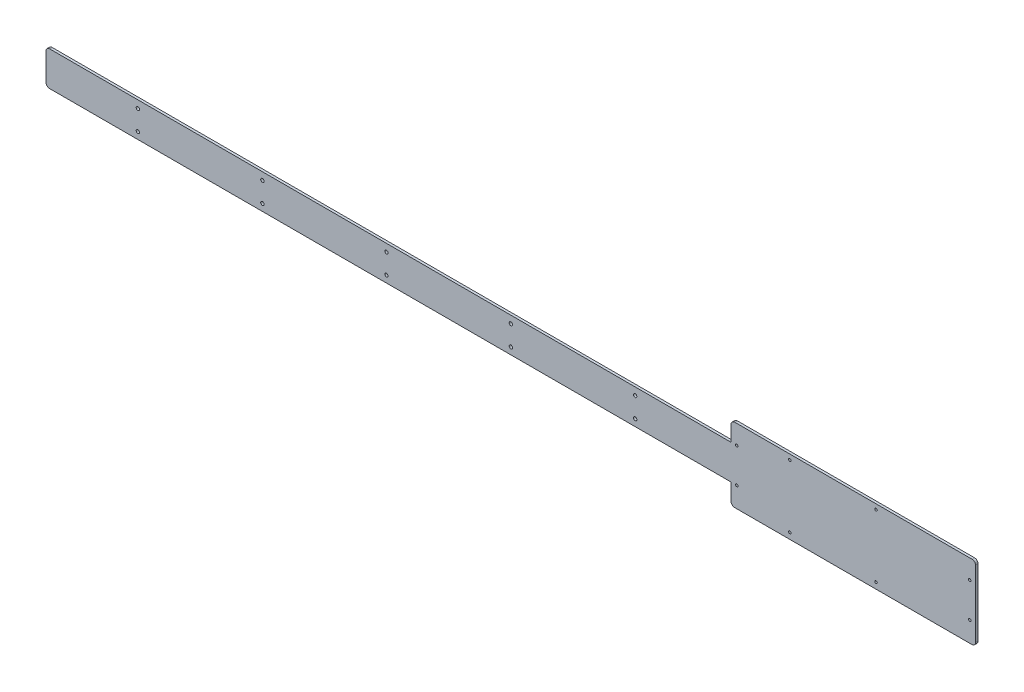
ISO-10303-21;
HEADER;
FILE_DESCRIPTION(('STEP AP214'),'2;1');
FILE_NAME('part.step','',(''),(''),'','','');
FILE_SCHEMA(('AUTOMOTIVE_DESIGN { 1 0 10303 214 1 1 1 1 }'));
ENDSEC;
DATA;
#1=APPLICATION_CONTEXT('core data for automotive mechanical design processes');
#2=APPLICATION_PROTOCOL_DEFINITION('international standard','automotive_design',2000,#1);
#3=PRODUCT_CONTEXT('',#1,'mechanical');
#4=PRODUCT('Part','Part','',(#3));
#5=PRODUCT_RELATED_PRODUCT_CATEGORY('part','',(#4));
#6=PRODUCT_DEFINITION_FORMATION('','',#4);
#7=PRODUCT_DEFINITION_CONTEXT('part definition',#1,'design');
#8=PRODUCT_DEFINITION('design','',#6,#7);
#9=PRODUCT_DEFINITION_SHAPE('','',#8);
#10=(LENGTH_UNIT() NAMED_UNIT(*) SI_UNIT(.MILLI.,.METRE.));
#11=(NAMED_UNIT(*) PLANE_ANGLE_UNIT() SI_UNIT($,.RADIAN.));
#12=(NAMED_UNIT(*) SI_UNIT($,.STERADIAN.) SOLID_ANGLE_UNIT());
#13=UNCERTAINTY_MEASURE_WITH_UNIT(LENGTH_MEASURE(1.E-05),#10,'distance_accuracy_value','');
#14=(GEOMETRIC_REPRESENTATION_CONTEXT(3) GLOBAL_UNCERTAINTY_ASSIGNED_CONTEXT((#13)) GLOBAL_UNIT_ASSIGNED_CONTEXT((#10,
#11,#12)) REPRESENTATION_CONTEXT('',''));
#15=CARTESIAN_POINT('',(0.,0.,0.));
#16=DIRECTION('',(0.,0.,1.));
#17=DIRECTION('',(1.,0.,0.));
#18=AXIS2_PLACEMENT_3D('',#15,#16,#17);
#19=CARTESIAN_POINT('',(699.960441306371,0.,2.54));
#20=DIRECTION('',(-1.,0.,0.));
#21=DIRECTION('',(0.,0.,1.));
#22=AXIS2_PLACEMENT_3D('',#19,#20,#21);
#23=PLANE('',#22);
#24=DIRECTION('',(0.,1.,0.));
#25=VECTOR('',#24,1.);
#26=CARTESIAN_POINT('',(699.960441306371,0.,0.));
#27=LINE('',#26,#25);
#28=CARTESIAN_POINT('',(699.960441306371,64.0125980584344,0.));
#29=VERTEX_POINT('',#28);
#30=CARTESIAN_POINT('',(699.960441306371,81.011908200962,0.));
#31=VERTEX_POINT('',#30);
#32=EDGE_CURVE('E384',#29,#31,#27,.T.);
#33=ORIENTED_EDGE('',*,*,#32,.F.);
#34=DIRECTION('',(0.,0.,-1.));
#35=VECTOR('',#34,1.);
#36=CARTESIAN_POINT('',(699.960441306371,64.0125980584344,2.54));
#37=LINE('',#36,#35);
#38=CARTESIAN_POINT('',(699.960441306371,64.0125980584344,2.54));
#39=VERTEX_POINT('',#38);
#40=EDGE_CURVE('E12',#39,#29,#37,.T.);
#41=ORIENTED_EDGE('',*,*,#40,.F.);
#42=DIRECTION('',(0.,1.,0.));
#43=VECTOR('',#42,1.);
#44=CARTESIAN_POINT('',(699.960441306371,0.,2.54));
#45=LINE('',#44,#43);
#46=CARTESIAN_POINT('',(699.960441306371,81.011908200962,2.54));
#47=VERTEX_POINT('',#46);
#48=EDGE_CURVE('E227',#39,#47,#45,.T.);
#49=ORIENTED_EDGE('',*,*,#48,.T.);
#50=DIRECTION('',(0.,0.,-1.));
#51=VECTOR('',#50,1.);
#52=CARTESIAN_POINT('',(699.960441306371,81.011908200962,2.54));
#53=LINE('',#52,#51);
#54=EDGE_CURVE('E113',#47,#31,#53,.T.);
#55=ORIENTED_EDGE('',*,*,#54,.T.);
#56=EDGE_LOOP('',(#33,#41,#49,#55));
#57=FACE_BOUND('',#56,.T.);
#58=ADVANCED_FACE('F42',(#57),#23,.T.);
#59=CARTESIAN_POINT('',(703.874541781116,64.1628071050607,2.54));
#60=DIRECTION('',(0.,0.,-1.));
#61=DIRECTION('',(-1.,0.,0.));
#62=AXIS2_PLACEMENT_3D('',#59,#60,#61);
#63=CYLINDRICAL_SURFACE('',#62,3.91698165480587);
#64=CARTESIAN_POINT('',(703.874541781116,64.1628071050607,0.));
#65=DIRECTION('',(0.,0.,1.));
#66=DIRECTION('',(1.,0.,0.));
#67=AXIS2_PLACEMENT_3D('',#64,#65,#66);
#68=CIRCLE('',#67,3.91698165480587);
#69=CARTESIAN_POINT('',(704.024750827742,60.2487066303159,0.));
#70=VERTEX_POINT('',#69);
#71=EDGE_CURVE('E381',#29,#70,#68,.T.);
#72=ORIENTED_EDGE('',*,*,#71,.T.);
#73=DIRECTION('',(0.,0.,-1.));
#74=VECTOR('',#73,1.);
#75=CARTESIAN_POINT('',(704.024750827742,60.2487066303159,2.54));
#76=LINE('',#75,#74);
#77=CARTESIAN_POINT('',(704.024750827742,60.2487066303159,2.54));
#78=VERTEX_POINT('',#77);
#79=EDGE_CURVE('E52',#78,#70,#76,.T.);
#80=ORIENTED_EDGE('',*,*,#79,.F.);
#81=CARTESIAN_POINT('',(703.874541781116,64.1628071050607,2.54));
#82=DIRECTION('',(0.,0.,1.));
#83=DIRECTION('',(1.,0.,0.));
#84=AXIS2_PLACEMENT_3D('',#81,#82,#83);
#85=CIRCLE('',#84,3.91698165480587);
#86=EDGE_CURVE('E222',#39,#78,#85,.T.);
#87=ORIENTED_EDGE('',*,*,#86,.F.);
#88=ORIENTED_EDGE('',*,*,#40,.T.);
#89=EDGE_LOOP('',(#72,#80,#87,#88));
#90=FACE_BOUND('',#89,.T.);
#91=ADVANCED_FACE('F382',(#90),#63,.T.);
#92=CARTESIAN_POINT('',(0.,60.2487066303159,2.54));
#93=DIRECTION('',(0.,1.,0.));
#94=DIRECTION('',(0.,0.,1.));
#95=AXIS2_PLACEMENT_3D('',#92,#93,#94);
#96=PLANE('',#95);
#97=DIRECTION('',(1.,0.,0.));
#98=VECTOR('',#97,1.);
#99=CARTESIAN_POINT('',(0.,60.2487066303159,0.));
#100=LINE('',#99,#98);
#101=CARTESIAN_POINT('',(946.192785632129,60.2487066303159,0.));
#102=VERTEX_POINT('',#101);
#103=EDGE_CURVE('E377',#70,#102,#100,.T.);
#104=ORIENTED_EDGE('',*,*,#103,.T.);
#105=DIRECTION('',(0.,0.,-1.));
#106=VECTOR('',#105,1.);
#107=CARTESIAN_POINT('',(946.192785632129,60.2487066303159,2.54));
#108=LINE('',#107,#106);
#109=CARTESIAN_POINT('',(946.192785632129,60.2487066303159,2.54));
#110=VERTEX_POINT('',#109);
#111=EDGE_CURVE('E367',#110,#102,#108,.T.);
#112=ORIENTED_EDGE('',*,*,#111,.F.);
#113=DIRECTION('',(1.,0.,0.));
#114=VECTOR('',#113,1.);
#115=CARTESIAN_POINT('',(0.,60.2487066303159,2.54));
#116=LINE('',#115,#114);
#117=EDGE_CURVE('E218',#78,#110,#116,.T.);
#118=ORIENTED_EDGE('',*,*,#117,.F.);
#119=ORIENTED_EDGE('',*,*,#79,.T.);
#120=EDGE_LOOP('',(#104,#112,#118,#119));
#121=FACE_BOUND('',#120,.T.);
#122=ADVANCED_FACE('F375',(#121),#96,.F.);
#123=CARTESIAN_POINT('',(946.083931557599,63.9037439839047,2.54));
#124=DIRECTION('',(0.,0.,-1.));
#125=DIRECTION('',(-1.,0.,0.));
#126=AXIS2_PLACEMENT_3D('',#123,#124,#125);
#127=CYLINDRICAL_SURFACE('',#126,3.65665793665086);
#128=CARTESIAN_POINT('',(946.083931557599,63.9037439839047,0.));
#129=DIRECTION('',(0.,0.,1.));
#130=DIRECTION('',(1.,0.,0.));
#131=AXIS2_PLACEMENT_3D('',#128,#129,#130);
#132=CIRCLE('',#131,3.65665793665086);
#133=CARTESIAN_POINT('',(949.738968911188,64.0125980584344,0.));
#134=VERTEX_POINT('',#133);
#135=EDGE_CURVE('E388',#134,#102,#132,.F.);
#136=ORIENTED_EDGE('',*,*,#135,.F.);
#137=DIRECTION('',(0.,0.,-1.));
#138=VECTOR('',#137,1.);
#139=CARTESIAN_POINT('',(949.738968911188,64.0125980584344,2.54));
#140=LINE('',#139,#138);
#141=CARTESIAN_POINT('',(949.738968911188,64.0125980584344,2.54));
#142=VERTEX_POINT('',#141);
#143=EDGE_CURVE('E364',#142,#134,#140,.T.);
#144=ORIENTED_EDGE('',*,*,#143,.F.);
#145=CARTESIAN_POINT('',(946.083931557599,63.9037439839047,2.54));
#146=DIRECTION('',(0.,0.,1.));
#147=DIRECTION('',(1.,0.,0.));
#148=AXIS2_PLACEMENT_3D('',#145,#146,#147);
#149=CIRCLE('',#148,3.65665793665086);
#150=EDGE_CURVE('E215',#142,#110,#149,.F.);
#151=ORIENTED_EDGE('',*,*,#150,.T.);
#152=ORIENTED_EDGE('',*,*,#111,.T.);
#153=EDGE_LOOP('',(#136,#144,#151,#152));
#154=FACE_BOUND('',#153,.T.);
#155=ADVANCED_FACE('F455',(#154),#127,.T.);
#156=CARTESIAN_POINT('',(949.738968911188,1.54013838980953E-12,2.54));
#157=DIRECTION('',(1.,0.,0.));
#158=DIRECTION('',(0.,1.,0.));
#159=AXIS2_PLACEMENT_3D('',#156,#157,#158);
#160=PLANE('',#159);
#161=DIRECTION('',(0.,-1.,0.));
#162=VECTOR('',#161,1.);
#163=CARTESIAN_POINT('',(949.738968911188,1.54013838980953E-12,0.));
#164=LINE('',#163,#162);
#165=CARTESIAN_POINT('',(949.738968911188,132.475411377396,0.));
#166=VERTEX_POINT('',#165);
#167=EDGE_CURVE('E396',#166,#134,#164,.T.);
#168=ORIENTED_EDGE('',*,*,#167,.F.);
#169=DIRECTION('',(0.,0.,-1.));
#170=VECTOR('',#169,1.);
#171=CARTESIAN_POINT('',(949.738968911188,132.475411377396,2.54));
#172=LINE('',#171,#170);
#173=CARTESIAN_POINT('',(949.738968911188,132.475411377396,2.54));
#174=VERTEX_POINT('',#173);
#175=EDGE_CURVE('E361',#174,#166,#172,.T.);
#176=ORIENTED_EDGE('',*,*,#175,.F.);
#177=DIRECTION('',(0.,-1.,0.));
#178=VECTOR('',#177,1.);
#179=CARTESIAN_POINT('',(949.738968911188,1.54013838980953E-12,2.54));
#180=LINE('',#179,#178);
#181=EDGE_CURVE('E210',#174,#142,#180,.T.);
#182=ORIENTED_EDGE('',*,*,#181,.T.);
#183=ORIENTED_EDGE('',*,*,#143,.T.);
#184=EDGE_LOOP('',(#168,#176,#182,#183));
#185=FACE_BOUND('',#184,.T.);
#186=ADVANCED_FACE('F451',(#185),#160,.T.);
#187=CARTESIAN_POINT('',(946.29718513407,132.371011875455,2.54));
#188=DIRECTION('',(0.,0.,-1.));
#189=DIRECTION('',(-1.,0.,0.));
#190=AXIS2_PLACEMENT_3D('',#187,#188,#189);
#191=CYLINDRICAL_SURFACE('',#190,3.44336678621955);
#192=CARTESIAN_POINT('',(946.29718513407,132.371011875455,0.));
#193=DIRECTION('',(0.,0.,1.));
#194=DIRECTION('',(1.,0.,0.));
#195=AXIS2_PLACEMENT_3D('',#192,#193,#194);
#196=CIRCLE('',#195,3.44336678621955);
#197=CARTESIAN_POINT('',(946.192785632129,135.812795652574,0.));
#198=VERTEX_POINT('',#197);
#199=EDGE_CURVE('E400',#198,#166,#196,.F.);
#200=ORIENTED_EDGE('',*,*,#199,.F.);
#201=DIRECTION('',(0.,0.,-1.));
#202=VECTOR('',#201,1.);
#203=CARTESIAN_POINT('',(946.192785632129,135.812795652574,2.54));
#204=LINE('',#203,#202);
#205=CARTESIAN_POINT('',(946.192785632129,135.812795652574,2.54));
#206=VERTEX_POINT('',#205);
#207=EDGE_CURVE('E358',#206,#198,#204,.T.);
#208=ORIENTED_EDGE('',*,*,#207,.F.);
#209=CARTESIAN_POINT('',(946.29718513407,132.371011875455,2.54));
#210=DIRECTION('',(0.,0.,1.));
#211=DIRECTION('',(1.,0.,0.));
#212=AXIS2_PLACEMENT_3D('',#209,#210,#211);
#213=CIRCLE('',#212,3.44336678621955);
#214=EDGE_CURVE('E204',#206,#174,#213,.F.);
#215=ORIENTED_EDGE('',*,*,#214,.T.);
#216=ORIENTED_EDGE('',*,*,#175,.T.);
#217=EDGE_LOOP('',(#200,#208,#215,#216));
#218=FACE_BOUND('',#217,.T.);
#219=ADVANCED_FACE('F447',(#218),#191,.T.);
#220=CARTESIAN_POINT('',(0.,135.812795652574,2.54));
#221=DIRECTION('',(0.,1.,0.));
#222=DIRECTION('',(0.,0.,1.));
#223=AXIS2_PLACEMENT_3D('',#220,#221,#222);
#224=PLANE('',#223);
#225=DIRECTION('',(1.,0.,0.));
#226=VECTOR('',#225,1.);
#227=CARTESIAN_POINT('',(0.,135.812795652574,0.));
#228=LINE('',#227,#226);
#229=CARTESIAN_POINT('',(704.024750827742,135.812795652574,0.));
#230=VERTEX_POINT('',#229);
#231=EDGE_CURVE('E404',#230,#198,#228,.T.);
#232=ORIENTED_EDGE('',*,*,#231,.F.);
#233=DIRECTION('',(0.,0.,-1.));
#234=VECTOR('',#233,1.);
#235=CARTESIAN_POINT('',(704.024750827742,135.812795652574,2.54));
#236=LINE('',#235,#234);
#237=CARTESIAN_POINT('',(704.024750827742,135.812795652574,2.54));
#238=VERTEX_POINT('',#237);
#239=EDGE_CURVE('E355',#238,#230,#236,.T.);
#240=ORIENTED_EDGE('',*,*,#239,.F.);
#241=DIRECTION('',(1.,0.,0.));
#242=VECTOR('',#241,1.);
#243=CARTESIAN_POINT('',(0.,135.812795652574,2.54));
#244=LINE('',#243,#242);
#245=EDGE_CURVE('E199',#238,#206,#244,.T.);
#246=ORIENTED_EDGE('',*,*,#245,.T.);
#247=ORIENTED_EDGE('',*,*,#207,.T.);
#248=EDGE_LOOP('',(#232,#240,#246,#247));
#249=FACE_BOUND('',#248,.T.);
#250=ADVANCED_FACE('F442',(#249),#224,.T.);
#251=CARTESIAN_POINT('',(703.946912219851,131.826324739094,2.54));
#252=DIRECTION('',(0.,0.,-1.));
#253=DIRECTION('',(-1.,0.,0.));
#254=AXIS2_PLACEMENT_3D('',#251,#252,#253);
#255=CYLINDRICAL_SURFACE('',#254,3.98723076744948);
#256=CARTESIAN_POINT('',(703.946912219851,131.826324739094,0.));
#257=DIRECTION('',(0.,0.,1.));
#258=DIRECTION('',(1.,0.,0.));
#259=AXIS2_PLACEMENT_3D('',#256,#257,#258);
#260=CIRCLE('',#259,3.98723076744948);
#261=CARTESIAN_POINT('',(699.960441306371,131.904163346986,0.));
#262=VERTEX_POINT('',#261);
#263=EDGE_CURVE('E408',#262,#230,#260,.F.);
#264=ORIENTED_EDGE('',*,*,#263,.F.);
#265=DIRECTION('',(0.,0.,-1.));
#266=VECTOR('',#265,1.);
#267=CARTESIAN_POINT('',(699.960441306371,131.904163346986,2.54));
#268=LINE('',#267,#266);
#269=CARTESIAN_POINT('',(699.960441306371,131.904163346986,2.54));
#270=VERTEX_POINT('',#269);
#271=EDGE_CURVE('E352',#270,#262,#268,.T.);
#272=ORIENTED_EDGE('',*,*,#271,.F.);
#273=CARTESIAN_POINT('',(703.946912219851,131.826324739094,2.54));
#274=DIRECTION('',(0.,0.,1.));
#275=DIRECTION('',(1.,0.,0.));
#276=AXIS2_PLACEMENT_3D('',#273,#274,#275);
#277=CIRCLE('',#276,3.98723076744948);
#278=EDGE_CURVE('E195',#270,#238,#277,.F.);
#279=ORIENTED_EDGE('',*,*,#278,.T.);
#280=ORIENTED_EDGE('',*,*,#239,.T.);
#281=EDGE_LOOP('',(#264,#272,#279,#280));
#282=FACE_BOUND('',#281,.T.);
#283=ADVANCED_FACE('F438',(#282),#255,.T.);
#284=CARTESIAN_POINT('',(699.960441306371,0.,2.54));
#285=DIRECTION('',(-1.,0.,0.));
#286=DIRECTION('',(0.,0.,1.));
#287=AXIS2_PLACEMENT_3D('',#284,#285,#286);
#288=PLANE('',#287);
#289=DIRECTION('',(0.,1.,0.));
#290=VECTOR('',#289,1.);
#291=CARTESIAN_POINT('',(699.960441306371,0.,0.));
#292=LINE('',#291,#290);
#293=CARTESIAN_POINT('',(699.960441306371,116.182433669927,0.));
#294=VERTEX_POINT('',#293);
#295=EDGE_CURVE('E412',#294,#262,#292,.T.);
#296=ORIENTED_EDGE('',*,*,#295,.F.);
#297=DIRECTION('',(0.,0.,-1.));
#298=VECTOR('',#297,1.);
#299=CARTESIAN_POINT('',(699.960441306371,116.182433669927,2.54));
#300=LINE('',#299,#298);
#301=CARTESIAN_POINT('',(699.960441306371,116.182433669927,2.54));
#302=VERTEX_POINT('',#301);
#303=EDGE_CURVE('E349',#302,#294,#300,.T.);
#304=ORIENTED_EDGE('',*,*,#303,.F.);
#305=DIRECTION('',(0.,1.,0.));
#306=VECTOR('',#305,1.);
#307=CARTESIAN_POINT('',(699.960441306371,0.,2.54));
#308=LINE('',#307,#306);
#309=EDGE_CURVE('E190',#302,#270,#308,.T.);
#310=ORIENTED_EDGE('',*,*,#309,.T.);
#311=ORIENTED_EDGE('',*,*,#271,.T.);
#312=EDGE_LOOP('',(#296,#304,#310,#311));
#313=FACE_BOUND('',#312,.T.);
#314=ADVANCED_FACE('F434',(#313),#288,.T.);
#315=CARTESIAN_POINT('',(0.,116.182433669927,2.54));
#316=DIRECTION('',(0.,1.,0.));
#317=DIRECTION('',(0.,0.,1.));
#318=AXIS2_PLACEMENT_3D('',#315,#316,#317);
#319=PLANE('',#318);
#320=DIRECTION('',(1.,0.,0.));
#321=VECTOR('',#320,1.);
#322=CARTESIAN_POINT('',(0.,116.182433669927,0.));
#323=LINE('',#322,#321);
#324=CARTESIAN_POINT('',(4.28543596522853,116.182433669927,0.));
#325=VERTEX_POINT('',#324);
#326=EDGE_CURVE('E416',#325,#294,#323,.T.);
#327=ORIENTED_EDGE('',*,*,#326,.F.);
#328=DIRECTION('',(0.,0.,-1.));
#329=VECTOR('',#328,1.);
#330=CARTESIAN_POINT('',(4.28543596522853,116.182433669927,2.54));
#331=LINE('',#330,#329);
#332=CARTESIAN_POINT('',(4.28543596522853,116.182433669927,2.54));
#333=VERTEX_POINT('',#332);
#334=EDGE_CURVE('E346',#333,#325,#331,.T.);
#335=ORIENTED_EDGE('',*,*,#334,.F.);
#336=DIRECTION('',(1.,0.,0.));
#337=VECTOR('',#336,1.);
#338=CARTESIAN_POINT('',(0.,116.182433669927,2.54));
#339=LINE('',#338,#337);
#340=EDGE_CURVE('E177',#333,#302,#339,.T.);
#341=ORIENTED_EDGE('',*,*,#340,.T.);
#342=ORIENTED_EDGE('',*,*,#303,.T.);
#343=EDGE_LOOP('',(#327,#335,#341,#342));
#344=FACE_BOUND('',#343,.T.);
#345=ADVANCED_FACE('F430',(#344),#319,.T.);
#346=CARTESIAN_POINT('',(4.13979787096996,112.402258463638,2.54));
#347=DIRECTION('',(0.,0.,-1.));
#348=DIRECTION('',(-1.,0.,0.));
#349=AXIS2_PLACEMENT_3D('',#346,#347,#348);
#350=CYLINDRICAL_SURFACE('',#349,3.78297965164233);
#351=CARTESIAN_POINT('',(4.13979787096996,112.402258463638,0.));
#352=DIRECTION('',(0.,0.,1.));
#353=DIRECTION('',(1.,0.,0.));
#354=AXIS2_PLACEMENT_3D('',#351,#352,#353);
#355=CIRCLE('',#354,3.78297965164233);
#356=CARTESIAN_POINT('',(0.359622664681157,112.547896557897,0.));
#357=VERTEX_POINT('',#356);
#358=EDGE_CURVE('E420',#357,#325,#355,.F.);
#359=ORIENTED_EDGE('',*,*,#358,.F.);
#360=DIRECTION('',(0.,0.,-1.));
#361=VECTOR('',#360,1.);
#362=CARTESIAN_POINT('',(0.359622664681157,112.547896557897,2.54));
#363=LINE('',#362,#361);
#364=CARTESIAN_POINT('',(0.359622664681157,112.547896557897,2.54));
#365=VERTEX_POINT('',#364);
#366=EDGE_CURVE('E161',#365,#357,#363,.T.);
#367=ORIENTED_EDGE('',*,*,#366,.F.);
#368=CARTESIAN_POINT('',(4.13979787096996,112.402258463638,2.54));
#369=DIRECTION('',(0.,0.,1.));
#370=DIRECTION('',(1.,0.,0.));
#371=AXIS2_PLACEMENT_3D('',#368,#369,#370);
#372=CIRCLE('',#371,3.78297965164233);
#373=EDGE_CURVE('E173',#365,#333,#372,.F.);
#374=ORIENTED_EDGE('',*,*,#373,.T.);
#375=ORIENTED_EDGE('',*,*,#334,.T.);
#376=EDGE_LOOP('',(#359,#367,#374,#375));
#377=FACE_BOUND('',#376,.T.);
#378=ADVANCED_FACE('F428',(#377),#350,.T.);
#379=CARTESIAN_POINT('',(0.359622664681157,0.,2.54));
#380=DIRECTION('',(-1.,0.,0.));
#381=DIRECTION('',(0.,0.,1.));
#382=AXIS2_PLACEMENT_3D('',#379,#380,#381);
#383=PLANE('',#382);
#384=DIRECTION('',(0.,1.,0.));
#385=VECTOR('',#384,1.);
#386=CARTESIAN_POINT('',(0.359622664681157,0.,0.));
#387=LINE('',#386,#385);
#388=CARTESIAN_POINT('',(0.359622664681157,84.6476269962459,0.));
#389=VERTEX_POINT('',#388);
#390=EDGE_CURVE('E157',#389,#357,#387,.T.);
#391=ORIENTED_EDGE('',*,*,#390,.F.);
#392=DIRECTION('',(0.,0.,-1.));
#393=VECTOR('',#392,1.);
#394=CARTESIAN_POINT('',(0.359622664681157,84.6476269962459,2.54));
#395=LINE('',#394,#393);
#396=CARTESIAN_POINT('',(0.359622664681157,84.6476269962459,2.54));
#397=VERTEX_POINT('',#396);
#398=EDGE_CURVE('E151',#397,#389,#395,.T.);
#399=ORIENTED_EDGE('',*,*,#398,.F.);
#400=DIRECTION('',(0.,1.,0.));
#401=VECTOR('',#400,1.);
#402=CARTESIAN_POINT('',(0.359622664681157,0.,2.54));
#403=LINE('',#402,#401);
#404=EDGE_CURVE('E155',#397,#365,#403,.T.);
#405=ORIENTED_EDGE('',*,*,#404,.T.);
#406=ORIENTED_EDGE('',*,*,#366,.T.);
#407=EDGE_LOOP('',(#391,#399,#405,#406));
#408=FACE_BOUND('',#407,.T.);
#409=ADVANCED_FACE('F153',(#408),#383,.T.);
#410=CARTESIAN_POINT('',(4.14038871259682,84.7926742488777,2.54));
#411=DIRECTION('',(0.,0.,-1.));
#412=DIRECTION('',(-1.,0.,0.));
#413=AXIS2_PLACEMENT_3D('',#410,#411,#412);
#414=CYLINDRICAL_SURFACE('',#413,3.7835473585734);
#415=CARTESIAN_POINT('',(4.14038871259682,84.7926742488777,0.));
#416=DIRECTION('',(0.,0.,1.));
#417=DIRECTION('',(1.,0.,0.));
#418=AXIS2_PLACEMENT_3D('',#415,#416,#417);
#419=CIRCLE('',#418,3.7835473585734);
#420=CARTESIAN_POINT('',(4.28543596522853,81.011908200962,0.));
#421=VERTEX_POINT('',#420);
#422=EDGE_CURVE('E333',#389,#421,#419,.T.);
#423=ORIENTED_EDGE('',*,*,#422,.T.);
#424=DIRECTION('',(0.,0.,-1.));
#425=VECTOR('',#424,1.);
#426=CARTESIAN_POINT('',(4.28543596522853,81.011908200962,2.54));
#427=LINE('',#426,#425);
#428=CARTESIAN_POINT('',(4.28543596522853,81.011908200962,2.54));
#429=VERTEX_POINT('',#428);
#430=EDGE_CURVE('E162',#429,#421,#427,.T.);
#431=ORIENTED_EDGE('',*,*,#430,.F.);
#432=CARTESIAN_POINT('',(4.14038871259682,84.7926742488777,2.54));
#433=DIRECTION('',(0.,0.,1.));
#434=DIRECTION('',(1.,0.,0.));
#435=AXIS2_PLACEMENT_3D('',#432,#433,#434);
#436=CIRCLE('',#435,3.7835473585734);
#437=EDGE_CURVE('E165',#397,#429,#436,.T.);
#438=ORIENTED_EDGE('',*,*,#437,.F.);
#439=ORIENTED_EDGE('',*,*,#398,.T.);
#440=EDGE_LOOP('',(#423,#431,#438,#439));
#441=FACE_BOUND('',#440,.T.);
#442=ADVANCED_FACE('F166',(#441),#414,.T.);
#443=CARTESIAN_POINT('',(94.1622142002001,88.0911071642846,2.54));
#444=DIRECTION('',(0.,0.,-1.));
#445=DIRECTION('',(-1.,0.,0.));
#446=AXIS2_PLACEMENT_3D('',#443,#444,#445);
#447=CYLINDRICAL_SURFACE('',#446,1.72009541650323);
#448=CARTESIAN_POINT('',(94.1622142002001,88.0911071642846,2.54));
#449=DIRECTION('',(0.,0.,1.));
#450=DIRECTION('',(1.,0.,0.));
#451=AXIS2_PLACEMENT_3D('',#448,#449,#450);
#452=CIRCLE('',#451,1.72009541650323);
#453=CARTESIAN_POINT('',(95.8823096167033,88.0911071642846,2.54));
#454=VERTEX_POINT('',#453);
#455=EDGE_CURVE('E235',#454,#454,#452,.T.);
#456=ORIENTED_EDGE('',*,*,#455,.T.);
#457=EDGE_LOOP('',(#456));
#458=FACE_BOUND('',#457,.T.);
#459=CARTESIAN_POINT('',(94.1622142002001,88.0911071642846,0.));
#460=DIRECTION('',(0.,0.,1.));
#461=DIRECTION('',(1.,0.,0.));
#462=AXIS2_PLACEMENT_3D('',#459,#460,#461);
#463=CIRCLE('',#462,1.72009541650323);
#464=CARTESIAN_POINT('',(95.8823096167033,88.0911071642846,0.));
#465=VERTEX_POINT('',#464);
#466=EDGE_CURVE('E390',#465,#465,#463,.T.);
#467=ORIENTED_EDGE('',*,*,#466,.F.);
#468=EDGE_LOOP('',(#467));
#469=FACE_BOUND('',#468,.T.);
#470=ADVANCED_FACE('F505',(#458,#469),#447,.F.);
#471=CARTESIAN_POINT('',(94.1622142002001,108.484732818826,2.54));
#472=DIRECTION('',(0.,0.,-1.));
#473=DIRECTION('',(-1.,0.,0.));
#474=AXIS2_PLACEMENT_3D('',#471,#472,#473);
#475=CYLINDRICAL_SURFACE('',#474,1.72009541650324);
#476=CARTESIAN_POINT('',(94.1622142002001,108.484732818826,2.54));
#477=DIRECTION('',(0.,0.,1.));
#478=DIRECTION('',(1.,0.,0.));
#479=AXIS2_PLACEMENT_3D('',#476,#477,#478);
#480=CIRCLE('',#479,1.72009541650324);
#481=CARTESIAN_POINT('',(95.8823096167033,108.484732818826,2.54));
#482=VERTEX_POINT('',#481);
#483=EDGE_CURVE('E239',#482,#482,#480,.T.);
#484=ORIENTED_EDGE('',*,*,#483,.T.);
#485=EDGE_LOOP('',(#484));
#486=FACE_BOUND('',#485,.T.);
#487=CARTESIAN_POINT('',(94.1622142002001,108.484732818826,0.));
#488=DIRECTION('',(0.,0.,1.));
#489=DIRECTION('',(1.,0.,0.));
#490=AXIS2_PLACEMENT_3D('',#487,#488,#489);
#491=CIRCLE('',#490,1.72009541650324);
#492=CARTESIAN_POINT('',(95.8823096167033,108.484732818826,0.));
#493=VERTEX_POINT('',#492);
#494=EDGE_CURVE('E514',#493,#493,#491,.T.);
#495=ORIENTED_EDGE('',*,*,#494,.F.);
#496=EDGE_LOOP('',(#495));
#497=FACE_BOUND('',#496,.T.);
#498=ADVANCED_FACE('F508',(#486,#497),#475,.F.);
#499=CARTESIAN_POINT('',(221.392126763807,108.484732818826,2.54));
#500=DIRECTION('',(0.,0.,-1.));
#501=DIRECTION('',(-1.,0.,0.));
#502=AXIS2_PLACEMENT_3D('',#499,#500,#501);
#503=CYLINDRICAL_SURFACE('',#502,1.72009541650327);
#504=CARTESIAN_POINT('',(221.392126763807,108.484732818826,2.54));
#505=DIRECTION('',(0.,0.,1.));
#506=DIRECTION('',(1.,0.,0.));
#507=AXIS2_PLACEMENT_3D('',#504,#505,#506);
#508=CIRCLE('',#507,1.72009541650327);
#509=CARTESIAN_POINT('',(223.11222218031,108.484732818826,2.54));
#510=VERTEX_POINT('',#509);
#511=EDGE_CURVE('E244',#510,#510,#508,.T.);
#512=ORIENTED_EDGE('',*,*,#511,.T.);
#513=EDGE_LOOP('',(#512));
#514=FACE_BOUND('',#513,.T.);
#515=CARTESIAN_POINT('',(221.392126763807,108.484732818826,0.));
#516=DIRECTION('',(0.,0.,1.));
#517=DIRECTION('',(1.,0.,0.));
#518=AXIS2_PLACEMENT_3D('',#515,#516,#517);
#519=CIRCLE('',#518,1.72009541650327);
#520=CARTESIAN_POINT('',(223.11222218031,108.484732818826,0.));
#521=VERTEX_POINT('',#520);
#522=EDGE_CURVE('E517',#521,#521,#519,.T.);
#523=ORIENTED_EDGE('',*,*,#522,.F.);
#524=EDGE_LOOP('',(#523));
#525=FACE_BOUND('',#524,.T.);
#526=ADVANCED_FACE('F606',(#514,#525),#503,.F.);
#527=CARTESIAN_POINT('',(221.392126763807,88.0911071642846,2.54));
#528=DIRECTION('',(0.,0.,-1.));
#529=DIRECTION('',(-1.,0.,0.));
#530=AXIS2_PLACEMENT_3D('',#527,#528,#529);
#531=CYLINDRICAL_SURFACE('',#530,1.72009541650326);
#532=CARTESIAN_POINT('',(221.392126763807,88.0911071642846,2.54));
#533=DIRECTION('',(0.,0.,1.));
#534=DIRECTION('',(1.,0.,0.));
#535=AXIS2_PLACEMENT_3D('',#532,#533,#534);
#536=CIRCLE('',#535,1.72009541650326);
#537=CARTESIAN_POINT('',(223.11222218031,88.0911071642846,2.54));
#538=VERTEX_POINT('',#537);
#539=EDGE_CURVE('E249',#538,#538,#536,.T.);
#540=ORIENTED_EDGE('',*,*,#539,.T.);
#541=EDGE_LOOP('',(#540));
#542=FACE_BOUND('',#541,.T.);
#543=CARTESIAN_POINT('',(221.392126763807,88.0911071642846,0.));
#544=DIRECTION('',(0.,0.,1.));
#545=DIRECTION('',(1.,0.,0.));
#546=AXIS2_PLACEMENT_3D('',#543,#544,#545);
#547=CIRCLE('',#546,1.72009541650326);
#548=CARTESIAN_POINT('',(223.11222218031,88.0911071642846,0.));
#549=VERTEX_POINT('',#548);
#550=EDGE_CURVE('E523',#549,#549,#547,.T.);
#551=ORIENTED_EDGE('',*,*,#550,.F.);
#552=EDGE_LOOP('',(#551));
#553=FACE_BOUND('',#552,.T.);
#554=ADVANCED_FACE('F610',(#542,#553),#531,.F.);
#555=CARTESIAN_POINT('',(348.078760153048,108.484732818826,2.54));
#556=DIRECTION('',(0.,0.,-1.));
#557=DIRECTION('',(-1.,0.,0.));
#558=AXIS2_PLACEMENT_3D('',#555,#556,#557);
#559=CYLINDRICAL_SURFACE('',#558,1.72009541650319);
#560=CARTESIAN_POINT('',(348.078760153048,108.484732818826,2.54));
#561=DIRECTION('',(0.,0.,1.));
#562=DIRECTION('',(1.,0.,0.));
#563=AXIS2_PLACEMENT_3D('',#560,#561,#562);
#564=CIRCLE('',#563,1.72009541650319);
#565=CARTESIAN_POINT('',(349.798855569551,108.484732818826,2.54));
#566=VERTEX_POINT('',#565);
#567=EDGE_CURVE('E257',#566,#566,#564,.T.);
#568=ORIENTED_EDGE('',*,*,#567,.T.);
#569=EDGE_LOOP('',(#568));
#570=FACE_BOUND('',#569,.T.);
#571=CARTESIAN_POINT('',(348.078760153048,108.484732818826,0.));
#572=DIRECTION('',(0.,0.,1.));
#573=DIRECTION('',(1.,0.,0.));
#574=AXIS2_PLACEMENT_3D('',#571,#572,#573);
#575=CIRCLE('',#574,1.72009541650319);
#576=CARTESIAN_POINT('',(349.798855569551,108.484732818826,0.));
#577=VERTEX_POINT('',#576);
#578=EDGE_CURVE('E527',#577,#577,#575,.T.);
#579=ORIENTED_EDGE('',*,*,#578,.F.);
#580=EDGE_LOOP('',(#579));
#581=FACE_BOUND('',#580,.T.);
#582=ADVANCED_FACE('F614',(#570,#581),#559,.F.);
#583=CARTESIAN_POINT('',(348.078760153048,88.0911071642846,2.54));
#584=DIRECTION('',(0.,0.,-1.));
#585=DIRECTION('',(-1.,0.,0.));
#586=AXIS2_PLACEMENT_3D('',#583,#584,#585);
#587=CYLINDRICAL_SURFACE('',#586,1.63233578285859);
#588=CARTESIAN_POINT('',(348.078760153048,88.0911071642846,2.54));
#589=DIRECTION('',(0.,0.,1.));
#590=DIRECTION('',(1.,0.,0.));
#591=AXIS2_PLACEMENT_3D('',#588,#589,#590);
#592=CIRCLE('',#591,1.63233578285859);
#593=CARTESIAN_POINT('',(349.711095935907,88.0911071642846,2.54));
#594=VERTEX_POINT('',#593);
#595=EDGE_CURVE('E261',#594,#594,#592,.T.);
#596=ORIENTED_EDGE('',*,*,#595,.T.);
#597=EDGE_LOOP('',(#596));
#598=FACE_BOUND('',#597,.T.);
#599=CARTESIAN_POINT('',(348.078760153048,88.0911071642846,0.));
#600=DIRECTION('',(0.,0.,1.));
#601=DIRECTION('',(1.,0.,0.));
#602=AXIS2_PLACEMENT_3D('',#599,#600,#601);
#603=CIRCLE('',#602,1.63233578285859);
#604=CARTESIAN_POINT('',(349.711095935907,88.0911071642846,0.));
#605=VERTEX_POINT('',#604);
#606=EDGE_CURVE('E531',#605,#605,#603,.T.);
#607=ORIENTED_EDGE('',*,*,#606,.F.);
#608=EDGE_LOOP('',(#607));
#609=FACE_BOUND('',#608,.T.);
#610=ADVANCED_FACE('F618',(#598,#609),#587,.F.);
#611=CARTESIAN_POINT('',(475.146430574631,108.484732818826,2.54));
#612=DIRECTION('',(0.,0.,-1.));
#613=DIRECTION('',(-1.,0.,0.));
#614=AXIS2_PLACEMENT_3D('',#611,#612,#613);
#615=CYLINDRICAL_SURFACE('',#614,1.72009541650319);
#616=CARTESIAN_POINT('',(475.146430574631,108.484732818826,2.54));
#617=DIRECTION('',(0.,0.,1.));
#618=DIRECTION('',(1.,0.,0.));
#619=AXIS2_PLACEMENT_3D('',#616,#617,#618);
#620=CIRCLE('',#619,1.72009541650319);
#621=CARTESIAN_POINT('',(476.866525991134,108.484732818826,2.54));
#622=VERTEX_POINT('',#621);
#623=EDGE_CURVE('E266',#622,#622,#620,.T.);
#624=ORIENTED_EDGE('',*,*,#623,.T.);
#625=EDGE_LOOP('',(#624));
#626=FACE_BOUND('',#625,.T.);
#627=CARTESIAN_POINT('',(475.146430574631,108.484732818826,0.));
#628=DIRECTION('',(0.,0.,1.));
#629=DIRECTION('',(1.,0.,0.));
#630=AXIS2_PLACEMENT_3D('',#627,#628,#629);
#631=CIRCLE('',#630,1.72009541650319);
#632=CARTESIAN_POINT('',(476.866525991134,108.484732818826,0.));
#633=VERTEX_POINT('',#632);
#634=EDGE_CURVE('E535',#633,#633,#631,.T.);
#635=ORIENTED_EDGE('',*,*,#634,.F.);
#636=EDGE_LOOP('',(#635));
#637=FACE_BOUND('',#636,.T.);
#638=ADVANCED_FACE('F622',(#626,#637),#615,.F.);
#639=CARTESIAN_POINT('',(475.146430574631,88.0911071642846,2.54));
#640=DIRECTION('',(0.,0.,-1.));
#641=DIRECTION('',(-1.,0.,0.));
#642=AXIS2_PLACEMENT_3D('',#639,#640,#641);
#643=CYLINDRICAL_SURFACE('',#642,1.72009541650318);
#644=CARTESIAN_POINT('',(475.146430574631,88.0911071642846,2.54));
#645=DIRECTION('',(0.,0.,1.));
#646=DIRECTION('',(1.,0.,0.));
#647=AXIS2_PLACEMENT_3D('',#644,#645,#646);
#648=CIRCLE('',#647,1.72009541650318);
#649=CARTESIAN_POINT('',(476.866525991134,88.0911071642846,2.54));
#650=VERTEX_POINT('',#649);
#651=EDGE_CURVE('E271',#650,#650,#648,.T.);
#652=ORIENTED_EDGE('',*,*,#651,.T.);
#653=EDGE_LOOP('',(#652));
#654=FACE_BOUND('',#653,.T.);
#655=CARTESIAN_POINT('',(475.146430574631,88.0911071642846,0.));
#656=DIRECTION('',(0.,0.,1.));
#657=DIRECTION('',(1.,0.,0.));
#658=AXIS2_PLACEMENT_3D('',#655,#656,#657);
#659=CIRCLE('',#658,1.72009541650318);
#660=CARTESIAN_POINT('',(476.866525991134,88.0911071642846,0.));
#661=VERTEX_POINT('',#660);
#662=EDGE_CURVE('E539',#661,#661,#659,.T.);
#663=ORIENTED_EDGE('',*,*,#662,.F.);
#664=EDGE_LOOP('',(#663));
#665=FACE_BOUND('',#664,.T.);
#666=ADVANCED_FACE('F626',(#654,#665),#643,.F.);
#667=CARTESIAN_POINT('',(602.130384221993,88.0911071642846,2.54));
#668=DIRECTION('',(0.,0.,-1.));
#669=DIRECTION('',(-1.,0.,0.));
#670=AXIS2_PLACEMENT_3D('',#667,#668,#669);
#671=CYLINDRICAL_SURFACE('',#670,1.72009541650318);
#672=CARTESIAN_POINT('',(602.130384221993,88.0911071642846,2.54));
#673=DIRECTION('',(0.,0.,1.));
#674=DIRECTION('',(1.,0.,0.));
#675=AXIS2_PLACEMENT_3D('',#672,#673,#674);
#676=CIRCLE('',#675,1.72009541650318);
#677=CARTESIAN_POINT('',(603.850479638496,88.0911071642846,2.54));
#678=VERTEX_POINT('',#677);
#679=EDGE_CURVE('E279',#678,#678,#676,.T.);
#680=ORIENTED_EDGE('',*,*,#679,.T.);
#681=EDGE_LOOP('',(#680));
#682=FACE_BOUND('',#681,.T.);
#683=CARTESIAN_POINT('',(602.130384221993,88.0911071642846,0.));
#684=DIRECTION('',(0.,0.,1.));
#685=DIRECTION('',(1.,0.,0.));
#686=AXIS2_PLACEMENT_3D('',#683,#684,#685);
#687=CIRCLE('',#686,1.72009541650318);
#688=CARTESIAN_POINT('',(603.850479638496,88.0911071642846,0.));
#689=VERTEX_POINT('',#688);
#690=EDGE_CURVE('E543',#689,#689,#687,.T.);
#691=ORIENTED_EDGE('',*,*,#690,.F.);
#692=EDGE_LOOP('',(#691));
#693=FACE_BOUND('',#692,.T.);
#694=ADVANCED_FACE('F630',(#682,#693),#671,.F.);
#695=CARTESIAN_POINT('',(602.130384221993,108.484732818826,2.54));
#696=DIRECTION('',(0.,0.,-1.));
#697=DIRECTION('',(-1.,0.,0.));
#698=AXIS2_PLACEMENT_3D('',#695,#696,#697);
#699=CYLINDRICAL_SURFACE('',#698,1.72009541650319);
#700=CARTESIAN_POINT('',(602.130384221993,108.484732818826,2.54));
#701=DIRECTION('',(0.,0.,1.));
#702=DIRECTION('',(1.,0.,0.));
#703=AXIS2_PLACEMENT_3D('',#700,#701,#702);
#704=CIRCLE('',#703,1.72009541650319);
#705=CARTESIAN_POINT('',(603.850479638496,108.484732818826,2.54));
#706=VERTEX_POINT('',#705);
#707=EDGE_CURVE('E283',#706,#706,#704,.T.);
#708=ORIENTED_EDGE('',*,*,#707,.T.);
#709=EDGE_LOOP('',(#708));
#710=FACE_BOUND('',#709,.T.);
#711=CARTESIAN_POINT('',(602.130384221993,108.484732818826,0.));
#712=DIRECTION('',(0.,0.,1.));
#713=DIRECTION('',(1.,0.,0.));
#714=AXIS2_PLACEMENT_3D('',#711,#712,#713);
#715=CIRCLE('',#714,1.72009541650319);
#716=CARTESIAN_POINT('',(603.850479638496,108.484732818826,0.));
#717=VERTEX_POINT('',#716);
#718=EDGE_CURVE('E547',#717,#717,#715,.T.);
#719=ORIENTED_EDGE('',*,*,#718,.F.);
#720=EDGE_LOOP('',(#719));
#721=FACE_BOUND('',#720,.T.);
#722=ADVANCED_FACE('F634',(#710,#721),#699,.F.);
#723=CARTESIAN_POINT('',(705.892847696466,116.182433669927,2.54));
#724=DIRECTION('',(0.,0.,-1.));
#725=DIRECTION('',(-1.,0.,0.));
#726=AXIS2_PLACEMENT_3D('',#723,#724,#725);
#727=CYLINDRICAL_SURFACE('',#726,1.27000000000003);
#728=CARTESIAN_POINT('',(705.892847696466,116.182433669927,2.54));
#729=DIRECTION('',(0.,0.,1.));
#730=DIRECTION('',(1.,0.,0.));
#731=AXIS2_PLACEMENT_3D('',#728,#729,#730);
#732=CIRCLE('',#731,1.27000000000003);
#733=CARTESIAN_POINT('',(707.162847696466,116.182433669927,2.54));
#734=VERTEX_POINT('',#733);
#735=EDGE_CURVE('E288',#734,#734,#732,.T.);
#736=ORIENTED_EDGE('',*,*,#735,.T.);
#737=EDGE_LOOP('',(#736));
#738=FACE_BOUND('',#737,.T.);
#739=CARTESIAN_POINT('',(705.892847696466,116.182433669927,0.));
#740=DIRECTION('',(0.,0.,1.));
#741=DIRECTION('',(1.,0.,0.));
#742=AXIS2_PLACEMENT_3D('',#739,#740,#741);
#743=CIRCLE('',#742,1.27000000000003);
#744=CARTESIAN_POINT('',(707.162847696466,116.182433669927,0.));
#745=VERTEX_POINT('',#744);
#746=EDGE_CURVE('E551',#745,#745,#743,.T.);
#747=ORIENTED_EDGE('',*,*,#746,.F.);
#748=EDGE_LOOP('',(#747));
#749=FACE_BOUND('',#748,.T.);
#750=ADVANCED_FACE('F638',(#738,#749),#727,.F.);
#751=CARTESIAN_POINT('',(705.892847696466,81.011908200962,2.54));
#752=DIRECTION('',(0.,0.,-1.));
#753=DIRECTION('',(-1.,0.,0.));
#754=AXIS2_PLACEMENT_3D('',#751,#752,#753);
#755=CYLINDRICAL_SURFACE('',#754,1.27000000000003);
#756=CARTESIAN_POINT('',(705.892847696466,81.011908200962,2.54));
#757=DIRECTION('',(0.,0.,1.));
#758=DIRECTION('',(1.,0.,0.));
#759=AXIS2_PLACEMENT_3D('',#756,#757,#758);
#760=CIRCLE('',#759,1.27000000000003);
#761=CARTESIAN_POINT('',(707.162847696466,81.011908200962,2.54));
#762=VERTEX_POINT('',#761);
#763=EDGE_CURVE('E293',#762,#762,#760,.T.);
#764=ORIENTED_EDGE('',*,*,#763,.T.);
#765=EDGE_LOOP('',(#764));
#766=FACE_BOUND('',#765,.T.);
#767=CARTESIAN_POINT('',(705.892847696466,81.011908200962,0.));
#768=DIRECTION('',(0.,0.,1.));
#769=DIRECTION('',(1.,0.,0.));
#770=AXIS2_PLACEMENT_3D('',#767,#768,#769);
#771=CIRCLE('',#770,1.27000000000003);
#772=CARTESIAN_POINT('',(707.162847696466,81.011908200962,0.));
#773=VERTEX_POINT('',#772);
#774=EDGE_CURVE('E555',#773,#773,#771,.T.);
#775=ORIENTED_EDGE('',*,*,#774,.F.);
#776=EDGE_LOOP('',(#775));
#777=FACE_BOUND('',#776,.T.);
#778=ADVANCED_FACE('F642',(#766,#777),#755,.F.);
#779=CARTESIAN_POINT('',(760.070975045827,130.611938178298,2.54));
#780=DIRECTION('',(0.,0.,-1.));
#781=DIRECTION('',(-1.,0.,0.));
#782=AXIS2_PLACEMENT_3D('',#779,#780,#781);
#783=CYLINDRICAL_SURFACE('',#782,1.27000000000003);
#784=CARTESIAN_POINT('',(760.070975045827,130.611938178298,2.54));
#785=DIRECTION('',(0.,0.,1.));
#786=DIRECTION('',(1.,0.,0.));
#787=AXIS2_PLACEMENT_3D('',#784,#785,#786);
#788=CIRCLE('',#787,1.27000000000003);
#789=CARTESIAN_POINT('',(761.340975045827,130.611938178298,2.54));
#790=VERTEX_POINT('',#789);
#791=EDGE_CURVE('E301',#790,#790,#788,.T.);
#792=ORIENTED_EDGE('',*,*,#791,.T.);
#793=EDGE_LOOP('',(#792));
#794=FACE_BOUND('',#793,.T.);
#795=CARTESIAN_POINT('',(760.070975045827,130.611938178298,0.));
#796=DIRECTION('',(0.,0.,1.));
#797=DIRECTION('',(1.,0.,0.));
#798=AXIS2_PLACEMENT_3D('',#795,#796,#797);
#799=CIRCLE('',#798,1.27000000000003);
#800=CARTESIAN_POINT('',(761.340975045827,130.611938178298,0.));
#801=VERTEX_POINT('',#800);
#802=EDGE_CURVE('E559',#801,#801,#799,.T.);
#803=ORIENTED_EDGE('',*,*,#802,.F.);
#804=EDGE_LOOP('',(#803));
#805=FACE_BOUND('',#804,.T.);
#806=ADVANCED_FACE('F646',(#794,#805),#783,.F.);
#807=CARTESIAN_POINT('',(760.070975045827,66.5052996614516,2.54));
#808=DIRECTION('',(0.,0.,-1.));
#809=DIRECTION('',(-1.,0.,0.));
#810=AXIS2_PLACEMENT_3D('',#807,#808,#809);
#811=CYLINDRICAL_SURFACE('',#810,1.27000000000003);
#812=CARTESIAN_POINT('',(760.070975045827,66.5052996614516,2.54));
#813=DIRECTION('',(0.,0.,1.));
#814=DIRECTION('',(1.,0.,0.));
#815=AXIS2_PLACEMENT_3D('',#812,#813,#814);
#816=CIRCLE('',#815,1.27000000000003);
#817=CARTESIAN_POINT('',(761.340975045827,66.5052996614516,2.54));
#818=VERTEX_POINT('',#817);
#819=EDGE_CURVE('E305',#818,#818,#816,.T.);
#820=ORIENTED_EDGE('',*,*,#819,.T.);
#821=EDGE_LOOP('',(#820));
#822=FACE_BOUND('',#821,.T.);
#823=CARTESIAN_POINT('',(760.070975045827,66.5052996614516,0.));
#824=DIRECTION('',(0.,0.,1.));
#825=DIRECTION('',(1.,0.,0.));
#826=AXIS2_PLACEMENT_3D('',#823,#824,#825);
#827=CIRCLE('',#826,1.27000000000003);
#828=CARTESIAN_POINT('',(761.340975045827,66.5052996614516,0.));
#829=VERTEX_POINT('',#828);
#830=EDGE_CURVE('E563',#829,#829,#827,.T.);
#831=ORIENTED_EDGE('',*,*,#830,.F.);
#832=EDGE_LOOP('',(#831));
#833=FACE_BOUND('',#832,.T.);
#834=ADVANCED_FACE('F650',(#822,#833),#811,.F.);
#835=CARTESIAN_POINT('',(848.138968911188,130.611938178298,2.54));
#836=DIRECTION('',(0.,0.,-1.));
#837=DIRECTION('',(-1.,0.,0.));
#838=AXIS2_PLACEMENT_3D('',#835,#836,#837);
#839=CYLINDRICAL_SURFACE('',#838,1.27000000000003);
#840=CARTESIAN_POINT('',(848.138968911188,130.611938178298,2.54));
#841=DIRECTION('',(0.,0.,1.));
#842=DIRECTION('',(1.,0.,0.));
#843=AXIS2_PLACEMENT_3D('',#840,#841,#842);
#844=CIRCLE('',#843,1.27000000000003);
#845=CARTESIAN_POINT('',(849.408968911188,130.611938178298,2.54));
#846=VERTEX_POINT('',#845);
#847=EDGE_CURVE('E310',#846,#846,#844,.T.);
#848=ORIENTED_EDGE('',*,*,#847,.T.);
#849=EDGE_LOOP('',(#848));
#850=FACE_BOUND('',#849,.T.);
#851=CARTESIAN_POINT('',(848.138968911188,130.611938178298,0.));
#852=DIRECTION('',(0.,0.,1.));
#853=DIRECTION('',(1.,0.,0.));
#854=AXIS2_PLACEMENT_3D('',#851,#852,#853);
#855=CIRCLE('',#854,1.27000000000003);
#856=CARTESIAN_POINT('',(849.408968911188,130.611938178298,0.));
#857=VERTEX_POINT('',#856);
#858=EDGE_CURVE('E567',#857,#857,#855,.T.);
#859=ORIENTED_EDGE('',*,*,#858,.F.);
#860=EDGE_LOOP('',(#859));
#861=FACE_BOUND('',#860,.T.);
#862=ADVANCED_FACE('F654',(#850,#861),#839,.F.);
#863=CARTESIAN_POINT('',(848.138968911188,66.5052996614516,2.54));
#864=DIRECTION('',(0.,0.,-1.));
#865=DIRECTION('',(-1.,0.,0.));
#866=AXIS2_PLACEMENT_3D('',#863,#864,#865);
#867=CYLINDRICAL_SURFACE('',#866,1.27000000000003);
#868=CARTESIAN_POINT('',(848.138968911188,66.5052996614516,2.54));
#869=DIRECTION('',(0.,0.,1.));
#870=DIRECTION('',(1.,0.,0.));
#871=AXIS2_PLACEMENT_3D('',#868,#869,#870);
#872=CIRCLE('',#871,1.27000000000003);
#873=CARTESIAN_POINT('',(849.408968911188,66.5052996614516,2.54));
#874=VERTEX_POINT('',#873);
#875=EDGE_CURVE('E315',#874,#874,#872,.T.);
#876=ORIENTED_EDGE('',*,*,#875,.T.);
#877=EDGE_LOOP('',(#876));
#878=FACE_BOUND('',#877,.T.);
#879=CARTESIAN_POINT('',(848.138968911188,66.5052996614516,0.));
#880=DIRECTION('',(0.,0.,1.));
#881=DIRECTION('',(1.,0.,0.));
#882=AXIS2_PLACEMENT_3D('',#879,#880,#881);
#883=CIRCLE('',#882,1.27000000000003);
#884=CARTESIAN_POINT('',(849.408968911188,66.5052996614516,0.));
#885=VERTEX_POINT('',#884);
#886=EDGE_CURVE('E571',#885,#885,#883,.T.);
#887=ORIENTED_EDGE('',*,*,#886,.F.);
#888=EDGE_LOOP('',(#887));
#889=FACE_BOUND('',#888,.T.);
#890=ADVANCED_FACE('F467',(#878,#889),#867,.F.);
#891=CARTESIAN_POINT('',(943.890172072689,116.182433669927,2.54));
#892=DIRECTION('',(0.,0.,-1.));
#893=DIRECTION('',(-1.,0.,0.));
#894=AXIS2_PLACEMENT_3D('',#891,#892,#893);
#895=CYLINDRICAL_SURFACE('',#894,1.27000000000003);
#896=CARTESIAN_POINT('',(943.890172072689,116.182433669927,2.54));
#897=DIRECTION('',(0.,0.,1.));
#898=DIRECTION('',(1.,0.,0.));
#899=AXIS2_PLACEMENT_3D('',#896,#897,#898);
#900=CIRCLE('',#899,1.27000000000003);
#901=CARTESIAN_POINT('',(945.160172072689,116.182433669927,2.54));
#902=VERTEX_POINT('',#901);
#903=EDGE_CURVE('E322',#902,#902,#900,.T.);
#904=ORIENTED_EDGE('',*,*,#903,.T.);
#905=EDGE_LOOP('',(#904));
#906=FACE_BOUND('',#905,.T.);
#907=CARTESIAN_POINT('',(943.890172072689,116.182433669927,0.));
#908=DIRECTION('',(0.,0.,1.));
#909=DIRECTION('',(1.,0.,0.));
#910=AXIS2_PLACEMENT_3D('',#907,#908,#909);
#911=CIRCLE('',#910,1.27000000000003);
#912=CARTESIAN_POINT('',(945.160172072689,116.182433669927,0.));
#913=VERTEX_POINT('',#912);
#914=EDGE_CURVE('E575',#913,#913,#911,.T.);
#915=ORIENTED_EDGE('',*,*,#914,.F.);
#916=EDGE_LOOP('',(#915));
#917=FACE_BOUND('',#916,.T.);
#918=ADVANCED_FACE('F589',(#906,#917),#895,.F.);
#919=CARTESIAN_POINT('',(943.890172072689,81.011908200962,2.54));
#920=DIRECTION('',(0.,0.,-1.));
#921=DIRECTION('',(-1.,0.,0.));
#922=AXIS2_PLACEMENT_3D('',#919,#920,#921);
#923=CYLINDRICAL_SURFACE('',#922,1.27000000000003);
#924=CARTESIAN_POINT('',(943.890172072689,81.011908200962,2.54));
#925=DIRECTION('',(0.,0.,1.));
#926=DIRECTION('',(1.,0.,0.));
#927=AXIS2_PLACEMENT_3D('',#924,#925,#926);
#928=CIRCLE('',#927,1.27000000000003);
#929=CARTESIAN_POINT('',(945.160172072689,81.011908200962,2.54));
#930=VERTEX_POINT('',#929);
#931=EDGE_CURVE('E326',#930,#930,#928,.T.);
#932=ORIENTED_EDGE('',*,*,#931,.T.);
#933=EDGE_LOOP('',(#932));
#934=FACE_BOUND('',#933,.T.);
#935=CARTESIAN_POINT('',(943.890172072689,81.011908200962,0.));
#936=DIRECTION('',(0.,0.,1.));
#937=DIRECTION('',(1.,0.,0.));
#938=AXIS2_PLACEMENT_3D('',#935,#936,#937);
#939=CIRCLE('',#938,1.27000000000003);
#940=CARTESIAN_POINT('',(945.160172072689,81.011908200962,0.));
#941=VERTEX_POINT('',#940);
#942=EDGE_CURVE('E579',#941,#941,#939,.T.);
#943=ORIENTED_EDGE('',*,*,#942,.F.);
#944=EDGE_LOOP('',(#943));
#945=FACE_BOUND('',#944,.T.);
#946=ADVANCED_FACE('F44',(#934,#945),#923,.F.);
#947=CARTESIAN_POINT('',(0.,81.011908200962,2.54));
#948=DIRECTION('',(0.,1.,0.));
#949=DIRECTION('',(0.,0.,1.));
#950=AXIS2_PLACEMENT_3D('',#947,#948,#949);
#951=PLANE('',#950);
#952=DIRECTION('',(1.,0.,0.));
#953=VECTOR('',#952,1.);
#954=CARTESIAN_POINT('',(0.,81.011908200962,0.));
#955=LINE('',#954,#953);
#956=EDGE_CURVE('E106',#421,#31,#955,.T.);
#957=ORIENTED_EDGE('',*,*,#956,.T.);
#958=ORIENTED_EDGE('',*,*,#54,.F.);
#959=DIRECTION('',(1.,0.,0.));
#960=VECTOR('',#959,1.);
#961=CARTESIAN_POINT('',(0.,81.011908200962,2.54));
#962=LINE('',#961,#960);
#963=EDGE_CURVE('E60',#429,#47,#962,.T.);
#964=ORIENTED_EDGE('',*,*,#963,.F.);
#965=ORIENTED_EDGE('',*,*,#430,.T.);
#966=EDGE_LOOP('',(#957,#958,#964,#965));
#967=FACE_BOUND('',#966,.T.);
#968=ADVANCED_FACE('F472',(#967),#951,.F.);
#969=CARTESIAN_POINT('',(0.,0.,2.54));
#970=DIRECTION('',(0.,0.,1.));
#971=DIRECTION('',(1.,0.,0.));
#972=AXIS2_PLACEMENT_3D('',#969,#970,#971);
#973=PLANE('',#972);
#974=ORIENTED_EDGE('',*,*,#931,.F.);
#975=EDGE_LOOP('',(#974));
#976=FACE_BOUND('',#975,.T.);
#977=ORIENTED_EDGE('',*,*,#903,.F.);
#978=EDGE_LOOP('',(#977));
#979=FACE_BOUND('',#978,.T.);
#980=ORIENTED_EDGE('',*,*,#875,.F.);
#981=EDGE_LOOP('',(#980));
#982=FACE_BOUND('',#981,.T.);
#983=ORIENTED_EDGE('',*,*,#847,.F.);
#984=EDGE_LOOP('',(#983));
#985=FACE_BOUND('',#984,.T.);
#986=ORIENTED_EDGE('',*,*,#819,.F.);
#987=EDGE_LOOP('',(#986));
#988=FACE_BOUND('',#987,.T.);
#989=ORIENTED_EDGE('',*,*,#791,.F.);
#990=EDGE_LOOP('',(#989));
#991=FACE_BOUND('',#990,.T.);
#992=ORIENTED_EDGE('',*,*,#763,.F.);
#993=EDGE_LOOP('',(#992));
#994=FACE_BOUND('',#993,.T.);
#995=ORIENTED_EDGE('',*,*,#735,.F.);
#996=EDGE_LOOP('',(#995));
#997=FACE_BOUND('',#996,.T.);
#998=ORIENTED_EDGE('',*,*,#707,.F.);
#999=EDGE_LOOP('',(#998));
#1000=FACE_BOUND('',#999,.T.);
#1001=ORIENTED_EDGE('',*,*,#679,.F.);
#1002=EDGE_LOOP('',(#1001));
#1003=FACE_BOUND('',#1002,.T.);
#1004=ORIENTED_EDGE('',*,*,#651,.F.);
#1005=EDGE_LOOP('',(#1004));
#1006=FACE_BOUND('',#1005,.T.);
#1007=ORIENTED_EDGE('',*,*,#623,.F.);
#1008=EDGE_LOOP('',(#1007));
#1009=FACE_BOUND('',#1008,.T.);
#1010=ORIENTED_EDGE('',*,*,#595,.F.);
#1011=EDGE_LOOP('',(#1010));
#1012=FACE_BOUND('',#1011,.T.);
#1013=ORIENTED_EDGE('',*,*,#567,.F.);
#1014=EDGE_LOOP('',(#1013));
#1015=FACE_BOUND('',#1014,.T.);
#1016=ORIENTED_EDGE('',*,*,#539,.F.);
#1017=EDGE_LOOP('',(#1016));
#1018=FACE_BOUND('',#1017,.T.);
#1019=ORIENTED_EDGE('',*,*,#511,.F.);
#1020=EDGE_LOOP('',(#1019));
#1021=FACE_BOUND('',#1020,.T.);
#1022=ORIENTED_EDGE('',*,*,#483,.F.);
#1023=EDGE_LOOP('',(#1022));
#1024=FACE_BOUND('',#1023,.T.);
#1025=ORIENTED_EDGE('',*,*,#455,.F.);
#1026=EDGE_LOOP('',(#1025));
#1027=FACE_BOUND('',#1026,.T.);
#1028=ORIENTED_EDGE('',*,*,#48,.F.);
#1029=ORIENTED_EDGE('',*,*,#86,.T.);
#1030=ORIENTED_EDGE('',*,*,#117,.T.);
#1031=ORIENTED_EDGE('',*,*,#150,.F.);
#1032=ORIENTED_EDGE('',*,*,#181,.F.);
#1033=ORIENTED_EDGE('',*,*,#214,.F.);
#1034=ORIENTED_EDGE('',*,*,#245,.F.);
#1035=ORIENTED_EDGE('',*,*,#278,.F.);
#1036=ORIENTED_EDGE('',*,*,#309,.F.);
#1037=ORIENTED_EDGE('',*,*,#340,.F.);
#1038=ORIENTED_EDGE('',*,*,#373,.F.);
#1039=ORIENTED_EDGE('',*,*,#404,.F.);
#1040=ORIENTED_EDGE('',*,*,#437,.T.);
#1041=ORIENTED_EDGE('',*,*,#963,.T.);
#1042=EDGE_LOOP('',(#1028,#1029,#1030,#1031,#1032,#1033,#1034,#1035,#1036,#1037,#1038,#1039,
#1040,#1041));
#1043=FACE_BOUND('',#1042,.T.);
#1044=ADVANCED_FACE('F170',(#976,#979,#982,#985,#988,#991,#994,#997,#1000,#1003,#1006,#1009,
#1012,#1015,#1018,#1021,#1024,#1027,#1043),#973,.T.);
#1045=CARTESIAN_POINT('',(0.,0.,0.));
#1046=DIRECTION('',(0.,0.,1.));
#1047=DIRECTION('',(1.,0.,0.));
#1048=AXIS2_PLACEMENT_3D('',#1045,#1046,#1047);
#1049=PLANE('',#1048);
#1050=ORIENTED_EDGE('',*,*,#942,.T.);
#1051=EDGE_LOOP('',(#1050));
#1052=FACE_BOUND('',#1051,.T.);
#1053=ORIENTED_EDGE('',*,*,#914,.T.);
#1054=EDGE_LOOP('',(#1053));
#1055=FACE_BOUND('',#1054,.T.);
#1056=ORIENTED_EDGE('',*,*,#886,.T.);
#1057=EDGE_LOOP('',(#1056));
#1058=FACE_BOUND('',#1057,.T.);
#1059=ORIENTED_EDGE('',*,*,#858,.T.);
#1060=EDGE_LOOP('',(#1059));
#1061=FACE_BOUND('',#1060,.T.);
#1062=ORIENTED_EDGE('',*,*,#830,.T.);
#1063=EDGE_LOOP('',(#1062));
#1064=FACE_BOUND('',#1063,.T.);
#1065=ORIENTED_EDGE('',*,*,#802,.T.);
#1066=EDGE_LOOP('',(#1065));
#1067=FACE_BOUND('',#1066,.T.);
#1068=ORIENTED_EDGE('',*,*,#774,.T.);
#1069=EDGE_LOOP('',(#1068));
#1070=FACE_BOUND('',#1069,.T.);
#1071=ORIENTED_EDGE('',*,*,#746,.T.);
#1072=EDGE_LOOP('',(#1071));
#1073=FACE_BOUND('',#1072,.T.);
#1074=ORIENTED_EDGE('',*,*,#718,.T.);
#1075=EDGE_LOOP('',(#1074));
#1076=FACE_BOUND('',#1075,.T.);
#1077=ORIENTED_EDGE('',*,*,#690,.T.);
#1078=EDGE_LOOP('',(#1077));
#1079=FACE_BOUND('',#1078,.T.);
#1080=ORIENTED_EDGE('',*,*,#662,.T.);
#1081=EDGE_LOOP('',(#1080));
#1082=FACE_BOUND('',#1081,.T.);
#1083=ORIENTED_EDGE('',*,*,#634,.T.);
#1084=EDGE_LOOP('',(#1083));
#1085=FACE_BOUND('',#1084,.T.);
#1086=ORIENTED_EDGE('',*,*,#606,.T.);
#1087=EDGE_LOOP('',(#1086));
#1088=FACE_BOUND('',#1087,.T.);
#1089=ORIENTED_EDGE('',*,*,#578,.T.);
#1090=EDGE_LOOP('',(#1089));
#1091=FACE_BOUND('',#1090,.T.);
#1092=ORIENTED_EDGE('',*,*,#550,.T.);
#1093=EDGE_LOOP('',(#1092));
#1094=FACE_BOUND('',#1093,.T.);
#1095=ORIENTED_EDGE('',*,*,#522,.T.);
#1096=EDGE_LOOP('',(#1095));
#1097=FACE_BOUND('',#1096,.T.);
#1098=ORIENTED_EDGE('',*,*,#494,.T.);
#1099=EDGE_LOOP('',(#1098));
#1100=FACE_BOUND('',#1099,.T.);
#1101=ORIENTED_EDGE('',*,*,#466,.T.);
#1102=EDGE_LOOP('',(#1101));
#1103=FACE_BOUND('',#1102,.T.);
#1104=ORIENTED_EDGE('',*,*,#32,.T.);
#1105=ORIENTED_EDGE('',*,*,#956,.F.);
#1106=ORIENTED_EDGE('',*,*,#422,.F.);
#1107=ORIENTED_EDGE('',*,*,#390,.T.);
#1108=ORIENTED_EDGE('',*,*,#358,.T.);
#1109=ORIENTED_EDGE('',*,*,#326,.T.);
#1110=ORIENTED_EDGE('',*,*,#295,.T.);
#1111=ORIENTED_EDGE('',*,*,#263,.T.);
#1112=ORIENTED_EDGE('',*,*,#231,.T.);
#1113=ORIENTED_EDGE('',*,*,#199,.T.);
#1114=ORIENTED_EDGE('',*,*,#167,.T.);
#1115=ORIENTED_EDGE('',*,*,#135,.T.);
#1116=ORIENTED_EDGE('',*,*,#103,.F.);
#1117=ORIENTED_EDGE('',*,*,#71,.F.);
#1118=EDGE_LOOP('',(#1104,#1105,#1106,#1107,#1108,#1109,#1110,#1111,#1112,#1113,#1114,#1115,
#1116,#1117));
#1119=FACE_BOUND('',#1118,.T.);
#1120=ADVANCED_FACE('F424',(#1052,#1055,#1058,#1061,#1064,#1067,#1070,#1073,#1076,#1079,#1082,
#1085,#1088,#1091,#1094,#1097,#1100,#1103,#1119),#1049,.F.);
#1121=CLOSED_SHELL('',(#58,#91,#122,#155,#186,#219,#250,#283,#314,#345,#378,#409,#442,#470,#498,
#526,#554,#582,#610,#638,#666,#694,#722,#750,#778,#806,#834,#862,#890,#918,#946,#968,#1044,#1120));
#1122=MANIFOLD_SOLID_BREP('B2',#1121);
#1123=ADVANCED_BREP_SHAPE_REPRESENTATION('',(#18,#1122),#14);
#1124=SHAPE_DEFINITION_REPRESENTATION(#9,#1123);
ENDSEC;
END-ISO-10303-21;
